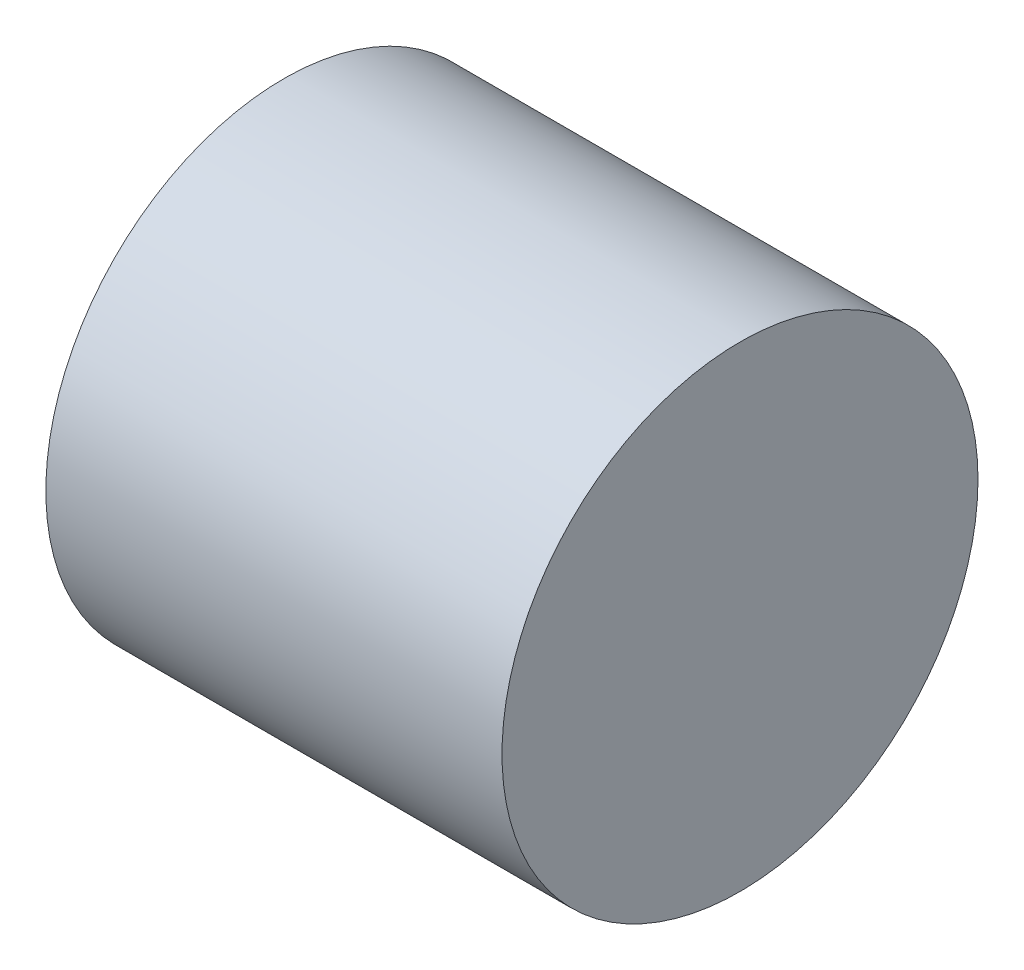
ISO-10303-21;
HEADER;
FILE_DESCRIPTION(('STEP AP214'),'2;1');
FILE_NAME('part.step','',(''),(''),'','','');
FILE_SCHEMA(('AUTOMOTIVE_DESIGN { 1 0 10303 214 1 1 1 1 }'));
ENDSEC;
DATA;
#1=APPLICATION_CONTEXT('core data for automotive mechanical design processes');
#2=APPLICATION_PROTOCOL_DEFINITION('international standard','automotive_design',2000,#1);
#3=PRODUCT_CONTEXT('',#1,'mechanical');
#4=PRODUCT('Part','Part','',(#3));
#5=PRODUCT_RELATED_PRODUCT_CATEGORY('part','',(#4));
#6=PRODUCT_DEFINITION_FORMATION('','',#4);
#7=PRODUCT_DEFINITION_CONTEXT('part definition',#1,'design');
#8=PRODUCT_DEFINITION('design','',#6,#7);
#9=PRODUCT_DEFINITION_SHAPE('','',#8);
#10=(LENGTH_UNIT() NAMED_UNIT(*) SI_UNIT(.MILLI.,.METRE.));
#11=(NAMED_UNIT(*) PLANE_ANGLE_UNIT() SI_UNIT($,.RADIAN.));
#12=(NAMED_UNIT(*) SI_UNIT($,.STERADIAN.) SOLID_ANGLE_UNIT());
#13=UNCERTAINTY_MEASURE_WITH_UNIT(LENGTH_MEASURE(1.E-05),#10,'distance_accuracy_value','');
#14=(GEOMETRIC_REPRESENTATION_CONTEXT(3) GLOBAL_UNCERTAINTY_ASSIGNED_CONTEXT((#13)) GLOBAL_UNIT_ASSIGNED_CONTEXT((#10,
#11,#12)) REPRESENTATION_CONTEXT('',''));
#15=CARTESIAN_POINT('',(0.,0.,0.));
#16=DIRECTION('',(0.,0.,1.));
#17=DIRECTION('',(1.,0.,0.));
#18=AXIS2_PLACEMENT_3D('',#15,#16,#17);
#19=CARTESIAN_POINT('',(23.,0.,0.));
#20=DIRECTION('',(-1.,0.,0.));
#21=DIRECTION('',(0.,0.,1.));
#22=AXIS2_PLACEMENT_3D('',#19,#20,#21);
#23=CYLINDRICAL_SURFACE('',#22,12.);
#24=CARTESIAN_POINT('',(23.,0.,0.));
#25=DIRECTION('',(1.,0.,0.));
#26=DIRECTION('',(0.,0.,-1.));
#27=AXIS2_PLACEMENT_3D('',#24,#25,#26);
#28=CIRCLE('',#27,12.);
#29=CARTESIAN_POINT('',(23.,0.,-12.));
#30=VERTEX_POINT('',#29);
#31=EDGE_CURVE('E11',#30,#30,#28,.T.);
#32=ORIENTED_EDGE('',*,*,#31,.F.);
#33=EDGE_LOOP('',(#32));
#34=FACE_BOUND('',#33,.T.);
#35=CARTESIAN_POINT('',(0.,0.,0.));
#36=DIRECTION('',(1.,0.,0.));
#37=DIRECTION('',(0.,0.,-1.));
#38=AXIS2_PLACEMENT_3D('',#35,#36,#37);
#39=CIRCLE('',#38,12.);
#40=CARTESIAN_POINT('',(0.,0.,-12.));
#41=VERTEX_POINT('',#40);
#42=EDGE_CURVE('E36',#41,#41,#39,.T.);
#43=ORIENTED_EDGE('',*,*,#42,.T.);
#44=EDGE_LOOP('',(#43));
#45=FACE_BOUND('',#44,.T.);
#46=ADVANCED_FACE('F33',(#34,#45),#23,.T.);
#47=CARTESIAN_POINT('',(23.,0.,0.));
#48=DIRECTION('',(1.,0.,0.));
#49=DIRECTION('',(0.,0.,-1.));
#50=AXIS2_PLACEMENT_3D('',#47,#48,#49);
#51=PLANE('',#50);
#52=ORIENTED_EDGE('',*,*,#31,.T.);
#53=EDGE_LOOP('',(#52));
#54=FACE_BOUND('',#53,.T.);
#55=ADVANCED_FACE('F86',(#54),#51,.T.);
#56=CARTESIAN_POINT('',(0.,0.,0.));
#57=DIRECTION('',(1.,0.,0.));
#58=DIRECTION('',(0.,0.,-1.));
#59=AXIS2_PLACEMENT_3D('',#56,#57,#58);
#60=PLANE('',#59);
#61=CARTESIAN_POINT('',(0.,0.,0.));
#62=DIRECTION('',(-1.,0.,0.));
#63=DIRECTION('',(0.,0.,1.));
#64=AXIS2_PLACEMENT_3D('',#61,#62,#63);
#65=CIRCLE('',#64,3.5);
#66=CARTESIAN_POINT('',(0.,-1.,3.35410196624969));
#67=VERTEX_POINT('',#66);
#68=CARTESIAN_POINT('',(0.,-1.,-3.35410196624968));
#69=VERTEX_POINT('',#68);
#70=EDGE_CURVE('E66',#67,#69,#65,.T.);
#71=ORIENTED_EDGE('',*,*,#70,.F.);
#72=DIRECTION('',(0.,0.,1.));
#73=VECTOR('',#72,1.);
#74=CARTESIAN_POINT('',(0.,-1.,0.));
#75=LINE('',#74,#73);
#76=EDGE_CURVE('E47',#69,#67,#75,.T.);
#77=ORIENTED_EDGE('',*,*,#76,.F.);
#78=EDGE_LOOP('',(#71,#77));
#79=FACE_BOUND('',#78,.T.);
#80=ORIENTED_EDGE('',*,*,#42,.F.);
#81=EDGE_LOOP('',(#80));
#82=FACE_BOUND('',#81,.T.);
#83=ADVANCED_FACE('F70',(#79,#82),#60,.F.);
#84=CARTESIAN_POINT('',(10.,-1.,0.));
#85=DIRECTION('',(0.,-1.,0.));
#86=DIRECTION('',(0.,0.,-1.));
#87=AXIS2_PLACEMENT_3D('',#84,#85,#86);
#88=PLANE('',#87);
#89=ORIENTED_EDGE('',*,*,#76,.T.);
#90=DIRECTION('',(-1.,0.,0.));
#91=VECTOR('',#90,1.);
#92=CARTESIAN_POINT('',(10.,-1.,3.35410196624968));
#93=LINE('',#92,#91);
#94=CARTESIAN_POINT('',(10.,-1.,3.35410196624968));
#95=VERTEX_POINT('',#94);
#96=EDGE_CURVE('E63',#95,#67,#93,.T.);
#97=ORIENTED_EDGE('',*,*,#96,.F.);
#98=DIRECTION('',(0.,0.,1.));
#99=VECTOR('',#98,1.);
#100=CARTESIAN_POINT('',(10.,-1.,0.));
#101=LINE('',#100,#99);
#102=CARTESIAN_POINT('',(10.,-1.,-3.35410196624968));
#103=VERTEX_POINT('',#102);
#104=EDGE_CURVE('E61',#103,#95,#101,.T.);
#105=ORIENTED_EDGE('',*,*,#104,.F.);
#106=DIRECTION('',(-1.,0.,0.));
#107=VECTOR('',#106,1.);
#108=CARTESIAN_POINT('',(10.,-1.,-3.35410196624968));
#109=LINE('',#108,#107);
#110=EDGE_CURVE('E55',#103,#69,#109,.T.);
#111=ORIENTED_EDGE('',*,*,#110,.T.);
#112=EDGE_LOOP('',(#89,#97,#105,#111));
#113=FACE_BOUND('',#112,.T.);
#114=ADVANCED_FACE('F59',(#113),#88,.F.);
#115=CARTESIAN_POINT('',(10.,0.,0.));
#116=DIRECTION('',(-1.,0.,0.));
#117=DIRECTION('',(0.,0.,1.));
#118=AXIS2_PLACEMENT_3D('',#115,#116,#117);
#119=CYLINDRICAL_SURFACE('',#118,3.5);
#120=ORIENTED_EDGE('',*,*,#70,.T.);
#121=ORIENTED_EDGE('',*,*,#110,.F.);
#122=CARTESIAN_POINT('',(10.,0.,0.));
#123=DIRECTION('',(-1.,0.,0.));
#124=DIRECTION('',(0.,0.,1.));
#125=AXIS2_PLACEMENT_3D('',#122,#123,#124);
#126=CIRCLE('',#125,3.5);
#127=EDGE_CURVE('E74',#95,#103,#126,.T.);
#128=ORIENTED_EDGE('',*,*,#127,.F.);
#129=ORIENTED_EDGE('',*,*,#96,.T.);
#130=EDGE_LOOP('',(#120,#121,#128,#129));
#131=FACE_BOUND('',#130,.T.);
#132=ADVANCED_FACE('F67',(#131),#119,.F.);
#133=CARTESIAN_POINT('',(10.,0.,0.));
#134=DIRECTION('',(-1.,0.,0.));
#135=DIRECTION('',(0.,0.,1.));
#136=AXIS2_PLACEMENT_3D('',#133,#134,#135);
#137=PLANE('',#136);
#138=ORIENTED_EDGE('',*,*,#104,.T.);
#139=ORIENTED_EDGE('',*,*,#127,.T.);
#140=EDGE_LOOP('',(#138,#139));
#141=FACE_BOUND('',#140,.T.);
#142=ADVANCED_FACE('F78',(#141),#137,.T.);
#143=CLOSED_SHELL('',(#46,#55,#83,#114,#132,#142));
#144=MANIFOLD_SOLID_BREP('B2',#143);
#145=ADVANCED_BREP_SHAPE_REPRESENTATION('',(#18,#144),#14);
#146=SHAPE_DEFINITION_REPRESENTATION(#9,#145);
ENDSEC;
END-ISO-10303-21;
